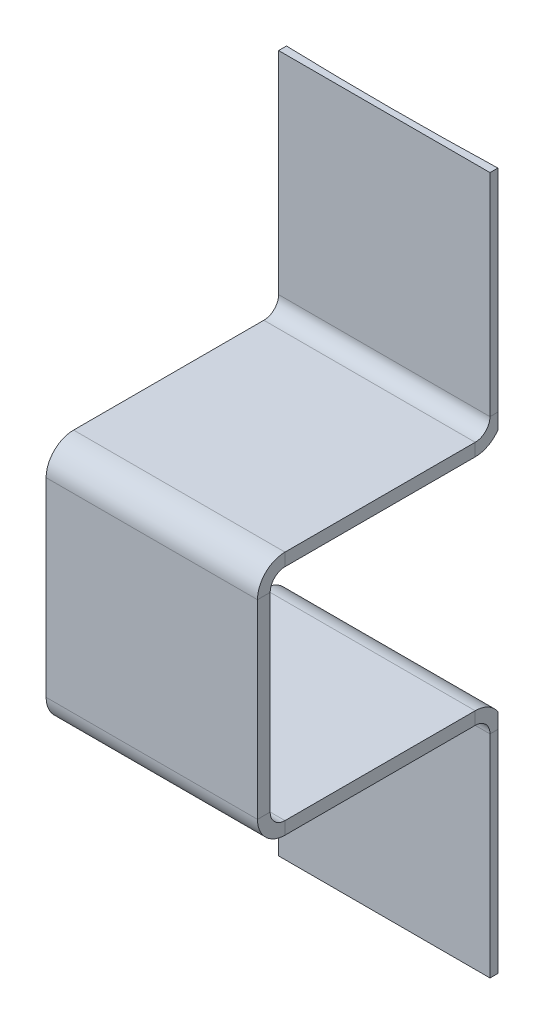
ISO-10303-21;
HEADER;
FILE_DESCRIPTION(('STEP AP214'),'2;1');
FILE_NAME('part.step','',(''),(''),'','','');
FILE_SCHEMA(('AUTOMOTIVE_DESIGN { 1 0 10303 214 1 1 1 1 }'));
ENDSEC;
DATA;
#1=APPLICATION_CONTEXT('core data for automotive mechanical design processes');
#2=APPLICATION_PROTOCOL_DEFINITION('international standard','automotive_design',2000,#1);
#3=PRODUCT_CONTEXT('',#1,'mechanical');
#4=PRODUCT('Part','Part','',(#3));
#5=PRODUCT_RELATED_PRODUCT_CATEGORY('part','',(#4));
#6=PRODUCT_DEFINITION_FORMATION('','',#4);
#7=PRODUCT_DEFINITION_CONTEXT('part definition',#1,'design');
#8=PRODUCT_DEFINITION('design','',#6,#7);
#9=PRODUCT_DEFINITION_SHAPE('','',#8);
#10=(LENGTH_UNIT() NAMED_UNIT(*) SI_UNIT(.MILLI.,.METRE.));
#11=(NAMED_UNIT(*) PLANE_ANGLE_UNIT() SI_UNIT($,.RADIAN.));
#12=(NAMED_UNIT(*) SI_UNIT($,.STERADIAN.) SOLID_ANGLE_UNIT());
#13=UNCERTAINTY_MEASURE_WITH_UNIT(LENGTH_MEASURE(1.E-05),#10,'distance_accuracy_value','');
#14=(GEOMETRIC_REPRESENTATION_CONTEXT(3) GLOBAL_UNCERTAINTY_ASSIGNED_CONTEXT((#13)) GLOBAL_UNIT_ASSIGNED_CONTEXT((#10,
#11,#12)) REPRESENTATION_CONTEXT('',''));
#15=CARTESIAN_POINT('',(0.,0.,0.));
#16=DIRECTION('',(0.,0.,1.));
#17=DIRECTION('',(1.,0.,0.));
#18=AXIS2_PLACEMENT_3D('',#15,#16,#17);
#19=CARTESIAN_POINT('',(0.,0.,0.));
#20=DIRECTION('',(0.,1.,0.));
#21=DIRECTION('',(0.,0.,-1.));
#22=AXIS2_PLACEMENT_3D('',#19,#20,#21);
#23=PLANE('',#22);
#24=CARTESIAN_POINT('',(0.,0.,-169.599));
#25=DIRECTION('',(0.,-1.,0.));
#26=DIRECTION('',(0.,0.,-1.));
#27=AXIS2_PLACEMENT_3D('',#24,#25,#26);
#28=CIRCLE('',#27,169.6);
#29=CARTESIAN_POINT('',(5.,0.,-0.0727188516187749));
#30=VERTEX_POINT('',#29);
#31=CARTESIAN_POINT('',(-5.,0.,-0.0727188516187749));
#32=VERTEX_POINT('',#31);
#33=EDGE_CURVE('E205',#30,#32,#28,.T.);
#34=ORIENTED_EDGE('',*,*,#33,.T.);
#35=DIRECTION('',(0.,0.,-1.));
#36=VECTOR('',#35,1.);
#37=CARTESIAN_POINT('',(-5.,0.,0.3));
#38=LINE('',#37,#36);
#39=CARTESIAN_POINT('',(-5.,0.,0.3));
#40=VERTEX_POINT('',#39);
#41=EDGE_CURVE('E277',#40,#32,#38,.T.);
#42=ORIENTED_EDGE('',*,*,#41,.F.);
#43=DIRECTION('',(-1.,0.,0.));
#44=VECTOR('',#43,1.);
#45=CARTESIAN_POINT('',(-5.,0.,0.3));
#46=LINE('',#45,#44);
#47=CARTESIAN_POINT('',(5.,0.,0.3));
#48=VERTEX_POINT('',#47);
#49=EDGE_CURVE('E276',#48,#40,#46,.T.);
#50=ORIENTED_EDGE('',*,*,#49,.F.);
#51=DIRECTION('',(0.,0.,1.));
#52=VECTOR('',#51,1.);
#53=CARTESIAN_POINT('',(5.,0.,0.3));
#54=LINE('',#53,#52);
#55=EDGE_CURVE('E273',#30,#48,#54,.T.);
#56=ORIENTED_EDGE('',*,*,#55,.F.);
#57=EDGE_LOOP('',(#34,#42,#50,#56));
#58=FACE_BOUND('',#57,.T.);
#59=ADVANCED_FACE('F41',(#58),#23,.T.);
#60=CARTESIAN_POINT('',(0.,-33.,0.));
#61=DIRECTION('',(0.,1.,0.));
#62=DIRECTION('',(0.,0.,-1.));
#63=AXIS2_PLACEMENT_3D('',#60,#61,#62);
#64=PLANE('',#63);
#65=DIRECTION('',(0.,0.,1.));
#66=VECTOR('',#65,1.);
#67=CARTESIAN_POINT('',(5.,-33.,0.300000000000001));
#68=LINE('',#67,#66);
#69=CARTESIAN_POINT('',(5.,-33.,-0.0727188516187749));
#70=VERTEX_POINT('',#69);
#71=CARTESIAN_POINT('',(5.,-33.,0.300000000000001));
#72=VERTEX_POINT('',#71);
#73=EDGE_CURVE('E209',#70,#72,#68,.T.);
#74=ORIENTED_EDGE('',*,*,#73,.T.);
#75=DIRECTION('',(-1.,0.,0.));
#76=VECTOR('',#75,1.);
#77=CARTESIAN_POINT('',(-5.,-33.,0.300000000000001));
#78=LINE('',#77,#76);
#79=CARTESIAN_POINT('',(-5.,-33.,0.300000000000001));
#80=VERTEX_POINT('',#79);
#81=EDGE_CURVE('E48',#72,#80,#78,.T.);
#82=ORIENTED_EDGE('',*,*,#81,.T.);
#83=DIRECTION('',(0.,0.,-1.));
#84=VECTOR('',#83,1.);
#85=CARTESIAN_POINT('',(-5.,-33.,0.300000000000001));
#86=LINE('',#85,#84);
#87=CARTESIAN_POINT('',(-5.,-33.,-0.0727188516187749));
#88=VERTEX_POINT('',#87);
#89=EDGE_CURVE('E191',#80,#88,#86,.T.);
#90=ORIENTED_EDGE('',*,*,#89,.T.);
#91=CARTESIAN_POINT('',(0.,-33.,-169.599));
#92=DIRECTION('',(0.,-1.,0.));
#93=DIRECTION('',(0.,0.,-1.));
#94=AXIS2_PLACEMENT_3D('',#91,#92,#93);
#95=CIRCLE('',#94,169.6);
#96=EDGE_CURVE('E199',#70,#88,#95,.T.);
#97=ORIENTED_EDGE('',*,*,#96,.F.);
#98=EDGE_LOOP('',(#74,#82,#90,#97));
#99=FACE_BOUND('',#98,.T.);
#100=ADVANCED_FACE('F207',(#99),#64,.F.);
#101=CARTESIAN_POINT('',(-5.,0.,0.3));
#102=DIRECTION('',(1.,0.,0.));
#103=DIRECTION('',(0.,0.,1.));
#104=AXIS2_PLACEMENT_3D('',#101,#102,#103);
#105=PLANE('',#104);
#106=DIRECTION('',(0.,0.,-1.));
#107=VECTOR('',#106,1.);
#108=CARTESIAN_POINT('',(-5.,-9.99999999999999,0.300000000000001));
#109=LINE('',#108,#107);
#110=CARTESIAN_POINT('',(-5.,-9.99999999999999,0.300000000000001));
#111=VERTEX_POINT('',#110);
#112=CARTESIAN_POINT('',(-5.,-9.99999999999999,-0.0727188516187749));
#113=VERTEX_POINT('',#112);
#114=EDGE_CURVE('E282',#111,#113,#109,.T.);
#115=ORIENTED_EDGE('',*,*,#114,.F.);
#116=DIRECTION('',(0.,-1.,0.));
#117=VECTOR('',#116,1.);
#118=CARTESIAN_POINT('',(-5.,0.,0.3));
#119=LINE('',#118,#117);
#120=EDGE_CURVE('E330',#40,#111,#119,.T.);
#121=ORIENTED_EDGE('',*,*,#120,.F.);
#122=ORIENTED_EDGE('',*,*,#41,.T.);
#123=DIRECTION('',(0.,1.,0.));
#124=VECTOR('',#123,1.);
#125=CARTESIAN_POINT('',(-5.,-33.,-0.0727188516187749));
#126=LINE('',#125,#124);
#127=EDGE_CURVE('E412',#113,#32,#126,.T.);
#128=ORIENTED_EDGE('',*,*,#127,.F.);
#129=EDGE_LOOP('',(#115,#121,#122,#128));
#130=FACE_BOUND('',#129,.T.);
#131=ADVANCED_FACE('F526',(#130),#105,.F.);
#132=CARTESIAN_POINT('',(5.,0.,0.3));
#133=DIRECTION('',(-1.,0.,0.));
#134=DIRECTION('',(0.,0.,-1.));
#135=AXIS2_PLACEMENT_3D('',#132,#133,#134);
#136=PLANE('',#135);
#137=ORIENTED_EDGE('',*,*,#55,.T.);
#138=DIRECTION('',(0.,-1.,0.));
#139=VECTOR('',#138,1.);
#140=CARTESIAN_POINT('',(5.,0.,0.3));
#141=LINE('',#140,#139);
#142=CARTESIAN_POINT('',(5.,-9.99999999999999,0.300000000000001));
#143=VERTEX_POINT('',#142);
#144=EDGE_CURVE('E281',#48,#143,#141,.T.);
#145=ORIENTED_EDGE('',*,*,#144,.T.);
#146=DIRECTION('',(0.,0.,1.));
#147=VECTOR('',#146,1.);
#148=CARTESIAN_POINT('',(5.,-9.99999999999999,0.300000000000001));
#149=LINE('',#148,#147);
#150=CARTESIAN_POINT('',(5.,-9.99999999999999,-0.0727188516187749));
#151=VERTEX_POINT('',#150);
#152=EDGE_CURVE('E278',#151,#143,#149,.T.);
#153=ORIENTED_EDGE('',*,*,#152,.F.);
#154=DIRECTION('',(0.,1.,0.));
#155=VECTOR('',#154,1.);
#156=CARTESIAN_POINT('',(5.,-33.,-0.0727188516187749));
#157=LINE('',#156,#155);
#158=EDGE_CURVE('E414',#30,#151,#157,.F.);
#159=ORIENTED_EDGE('',*,*,#158,.F.);
#160=EDGE_LOOP('',(#137,#145,#153,#159));
#161=FACE_BOUND('',#160,.T.);
#162=ADVANCED_FACE('F474',(#161),#136,.F.);
#163=CARTESIAN_POINT('',(-5.,0.,0.3));
#164=DIRECTION('',(0.,0.,-1.));
#165=DIRECTION('',(0.,-1.,0.));
#166=AXIS2_PLACEMENT_3D('',#163,#164,#165);
#167=PLANE('',#166);
#168=DIRECTION('',(-1.,0.,0.));
#169=VECTOR('',#168,1.);
#170=CARTESIAN_POINT('',(-5.,-9.99999999999999,0.300000000000001));
#171=LINE('',#170,#169);
#172=EDGE_CURVE('E285',#143,#111,#171,.T.);
#173=ORIENTED_EDGE('',*,*,#172,.F.);
#174=ORIENTED_EDGE('',*,*,#144,.F.);
#175=ORIENTED_EDGE('',*,*,#49,.T.);
#176=ORIENTED_EDGE('',*,*,#120,.T.);
#177=EDGE_LOOP('',(#173,#174,#175,#176));
#178=FACE_BOUND('',#177,.T.);
#179=ADVANCED_FACE('F539',(#178),#167,.F.);
#180=CARTESIAN_POINT('',(-5.,-9.99999999999999,0.300000000000001));
#181=DIRECTION('',(1.,0.,0.));
#182=DIRECTION('',(0.,0.,1.));
#183=AXIS2_PLACEMENT_3D('',#180,#181,#182);
#184=PLANE('',#183);
#185=CARTESIAN_POINT('',(-5.,-10.,1.));
#186=DIRECTION('',(-1.,0.,0.));
#187=DIRECTION('',(0.,0.,-1.));
#188=AXIS2_PLACEMENT_3D('',#185,#186,#187);
#189=CIRCLE('',#188,1.3);
#190=CARTESIAN_POINT('',(-5.,-10.7343529569503,-0.0727188516187749));
#191=VERTEX_POINT('',#190);
#192=CARTESIAN_POINT('',(-5.,-11.3,1.00000000000001));
#193=VERTEX_POINT('',#192);
#194=EDGE_CURVE('E224',#191,#193,#189,.T.);
#195=ORIENTED_EDGE('',*,*,#194,.T.);
#196=DIRECTION('',(0.,-1.,0.));
#197=VECTOR('',#196,1.);
#198=CARTESIAN_POINT('',(-5.,-10.7,1.00000000000001));
#199=LINE('',#198,#197);
#200=CARTESIAN_POINT('',(-5.,-10.7,1.00000000000001));
#201=VERTEX_POINT('',#200);
#202=EDGE_CURVE('E401',#201,#193,#199,.T.);
#203=ORIENTED_EDGE('',*,*,#202,.F.);
#204=CARTESIAN_POINT('',(-5.,-10.,1.));
#205=DIRECTION('',(-1.,0.,0.));
#206=DIRECTION('',(0.,0.,-1.));
#207=AXIS2_PLACEMENT_3D('',#204,#205,#206);
#208=CIRCLE('',#207,0.700000000000001);
#209=EDGE_CURVE('E333',#111,#201,#208,.T.);
#210=ORIENTED_EDGE('',*,*,#209,.F.);
#211=ORIENTED_EDGE('',*,*,#114,.T.);
#212=DIRECTION('',(0.,1.,0.));
#213=VECTOR('',#212,1.);
#214=CARTESIAN_POINT('',(-5.,-33.,-0.0727188516187749));
#215=LINE('',#214,#213);
#216=EDGE_CURVE('E416',#191,#113,#215,.T.);
#217=ORIENTED_EDGE('',*,*,#216,.F.);
#218=EDGE_LOOP('',(#195,#203,#210,#211,#217));
#219=FACE_BOUND('',#218,.T.);
#220=ADVANCED_FACE('F435',(#219),#184,.F.);
#221=CARTESIAN_POINT('',(0.,-10.,1.));
#222=DIRECTION('',(1.,0.,0.));
#223=DIRECTION('',(0.,0.,1.));
#224=AXIS2_PLACEMENT_3D('',#221,#222,#223);
#225=CYLINDRICAL_SURFACE('',#224,1.3);
#226=CARTESIAN_POINT('',(5.,-10.,1.));
#227=DIRECTION('',(-1.,0.,0.));
#228=DIRECTION('',(0.,0.,-1.));
#229=AXIS2_PLACEMENT_3D('',#226,#227,#228);
#230=CIRCLE('',#229,1.3);
#231=CARTESIAN_POINT('',(5.,-10.7343529569503,-0.0727188516187749));
#232=VERTEX_POINT('',#231);
#233=CARTESIAN_POINT('',(5.,-11.3,1.00000000000001));
#234=VERTEX_POINT('',#233);
#235=EDGE_CURVE('E223',#232,#234,#230,.T.);
#236=ORIENTED_EDGE('',*,*,#235,.T.);
#237=DIRECTION('',(1.,0.,0.));
#238=VECTOR('',#237,1.);
#239=CARTESIAN_POINT('',(-5.,-11.3,1.00000000000001));
#240=LINE('',#239,#238);
#241=EDGE_CURVE('E220',#193,#234,#240,.T.);
#242=ORIENTED_EDGE('',*,*,#241,.F.);
#243=ORIENTED_EDGE('',*,*,#194,.F.);
#244=CARTESIAN_POINT('',(5.,-10.7343529569503,-0.0727188516187749));
#245=CARTESIAN_POINT('',(4.56710657150074,-10.7529223545076,-0.0599507829004519));
#246=CARTESIAN_POINT('',(4.13403927755849,-10.7682262464902,-0.0488378920569281));
#247=CARTESIAN_POINT('',(3.48433641418812,-10.7871174579659,-0.0346573580335505));
#248=CARTESIAN_POINT('',(3.26778670418943,-10.7927365126097,-0.0303458080338849));
#249=CARTESIAN_POINT('',(2.83464152802516,-10.8027605156565,-0.0225519574346682));
#250=CARTESIAN_POINT('',(2.6180460611939,-10.807165444975,-0.0190696698702353));
#251=CARTESIAN_POINT('',(1.78491533421112,-10.8219574039432,-0.00727192238790079));
#252=CARTESIAN_POINT('',(1.16826225589085,-10.8283747085537,-0.00190258279581291));
#253=CARTESIAN_POINT('',(-0.0651044875729709,-10.8331981860363,0.00210871445944375));
#254=CARTESIAN_POINT('',(-0.681818153598923,-10.8316042164473,0.000750552490463859));
#255=CARTESIAN_POINT('',(-1.60707138051038,-10.8229836608874,-0.0063333804057084));
#256=CARTESIAN_POINT('',(-1.91566258517029,-10.8190686160109,-0.00953846242033991));
#257=CARTESIAN_POINT('',(-2.53278542991408,-10.8089910077911,-0.0176324407112478));
#258=CARTESIAN_POINT('',(-2.84131707032667,-10.8028284572274,-0.0225213274133516));
#259=CARTESIAN_POINT('',(-3.45828794792507,-10.7880189099031,-0.0339816884898349));
#260=CARTESIAN_POINT('',(-3.76672718593358,-10.7793719359627,-0.040553147409192));
#261=CARTESIAN_POINT('',(-4.38347492480908,-10.7591596553084,-0.05537637003732));
#262=CARTESIAN_POINT('',(-4.69178342303212,-10.7475942921546,-0.0636281662421999));
#263=CARTESIAN_POINT('',(-5.,-10.7343529569504,-0.0727188516187486));
#264=B_SPLINE_CURVE_WITH_KNOTS('',3,(#244,#245,#246,#247,#248,#249,#250,#251,#252,#253,#254,
#255,#256,#257,#258,#259,#260,#261,#262,#263),.UNSPECIFIED.,.F.,.F.,(4,2,2,2,2,2,2,2,2,4),(0.,
1.30040062071421,1.95039151468905,2.60039262515101,4.45041805959426,6.30047639232974,
7.22636385438622,8.15224605190095,9.07811974516451,10.0040113456367),.UNSPECIFIED.);
#265=EDGE_CURVE('E418',#232,#191,#264,.T.);
#266=ORIENTED_EDGE('',*,*,#265,.F.);
#267=EDGE_LOOP('',(#236,#242,#243,#266));
#268=FACE_BOUND('',#267,.T.);
#269=ADVANCED_FACE('F429',(#268),#225,.T.);
#270=CARTESIAN_POINT('',(5.,-9.99999999999999,0.300000000000001));
#271=DIRECTION('',(-1.,0.,0.));
#272=DIRECTION('',(0.,0.,-1.));
#273=AXIS2_PLACEMENT_3D('',#270,#271,#272);
#274=PLANE('',#273);
#275=ORIENTED_EDGE('',*,*,#152,.T.);
#276=CARTESIAN_POINT('',(5.,-10.,1.));
#277=DIRECTION('',(-1.,0.,0.));
#278=DIRECTION('',(0.,0.,-1.));
#279=AXIS2_PLACEMENT_3D('',#276,#277,#278);
#280=CIRCLE('',#279,0.700000000000001);
#281=CARTESIAN_POINT('',(5.,-10.7,1.00000000000001));
#282=VERTEX_POINT('',#281);
#283=EDGE_CURVE('E288',#143,#282,#280,.T.);
#284=ORIENTED_EDGE('',*,*,#283,.T.);
#285=DIRECTION('',(0.,1.,0.));
#286=VECTOR('',#285,1.);
#287=CARTESIAN_POINT('',(5.,-10.7,1.00000000000001));
#288=LINE('',#287,#286);
#289=EDGE_CURVE('E227',#234,#282,#288,.T.);
#290=ORIENTED_EDGE('',*,*,#289,.F.);
#291=ORIENTED_EDGE('',*,*,#235,.F.);
#292=DIRECTION('',(0.,1.,0.));
#293=VECTOR('',#292,1.);
#294=CARTESIAN_POINT('',(5.,-33.,-0.0727188516187749));
#295=LINE('',#294,#293);
#296=EDGE_CURVE('E55',#151,#232,#295,.F.);
#297=ORIENTED_EDGE('',*,*,#296,.F.);
#298=EDGE_LOOP('',(#275,#284,#290,#291,#297));
#299=FACE_BOUND('',#298,.T.);
#300=ADVANCED_FACE('F434',(#299),#274,.F.);
#301=CARTESIAN_POINT('',(0.,-10.,1.));
#302=DIRECTION('',(1.,0.,0.));
#303=DIRECTION('',(0.,0.,1.));
#304=AXIS2_PLACEMENT_3D('',#301,#302,#303);
#305=CYLINDRICAL_SURFACE('',#304,0.700000000000001);
#306=DIRECTION('',(-1.,0.,0.));
#307=VECTOR('',#306,1.);
#308=CARTESIAN_POINT('',(-5.,-10.7,1.00000000000001));
#309=LINE('',#308,#307);
#310=EDGE_CURVE('E291',#282,#201,#309,.T.);
#311=ORIENTED_EDGE('',*,*,#310,.F.);
#312=ORIENTED_EDGE('',*,*,#283,.F.);
#313=ORIENTED_EDGE('',*,*,#172,.T.);
#314=ORIENTED_EDGE('',*,*,#209,.T.);
#315=EDGE_LOOP('',(#311,#312,#313,#314));
#316=FACE_BOUND('',#315,.T.);
#317=ADVANCED_FACE('F550',(#316),#305,.F.);
#318=CARTESIAN_POINT('',(-5.,-10.7,1.00000000000001));
#319=DIRECTION('',(1.,0.,0.));
#320=DIRECTION('',(0.,0.,1.));
#321=AXIS2_PLACEMENT_3D('',#318,#319,#320);
#322=PLANE('',#321);
#323=DIRECTION('',(0.,0.,1.));
#324=VECTOR('',#323,1.);
#325=CARTESIAN_POINT('',(-5.,-11.3,1.00000000000001));
#326=LINE('',#325,#324);
#327=CARTESIAN_POINT('',(-5.,-11.3,9.99999999999999));
#328=VERTEX_POINT('',#327);
#329=EDGE_CURVE('E232',#193,#328,#326,.T.);
#330=ORIENTED_EDGE('',*,*,#329,.T.);
#331=DIRECTION('',(0.,-1.,0.));
#332=VECTOR('',#331,1.);
#333=CARTESIAN_POINT('',(-5.,-10.7,9.99999999999999));
#334=LINE('',#333,#332);
#335=CARTESIAN_POINT('',(-5.,-10.7,9.99999999999999));
#336=VERTEX_POINT('',#335);
#337=EDGE_CURVE('E394',#336,#328,#334,.T.);
#338=ORIENTED_EDGE('',*,*,#337,.F.);
#339=DIRECTION('',(0.,0.,1.));
#340=VECTOR('',#339,1.);
#341=CARTESIAN_POINT('',(-5.,-10.7,1.00000000000001));
#342=LINE('',#341,#340);
#343=EDGE_CURVE('E336',#201,#336,#342,.T.);
#344=ORIENTED_EDGE('',*,*,#343,.F.);
#345=ORIENTED_EDGE('',*,*,#202,.T.);
#346=EDGE_LOOP('',(#330,#338,#344,#345));
#347=FACE_BOUND('',#346,.T.);
#348=ADVANCED_FACE('F442',(#347),#322,.F.);
#349=CARTESIAN_POINT('',(-5.,-11.3,1.00000000000001));
#350=DIRECTION('',(0.,1.,0.));
#351=DIRECTION('',(0.,0.,-1.));
#352=AXIS2_PLACEMENT_3D('',#349,#350,#351);
#353=PLANE('',#352);
#354=DIRECTION('',(0.,0.,1.));
#355=VECTOR('',#354,1.);
#356=CARTESIAN_POINT('',(5.,-11.3,1.00000000000001));
#357=LINE('',#356,#355);
#358=CARTESIAN_POINT('',(5.,-11.3,9.99999999999999));
#359=VERTEX_POINT('',#358);
#360=EDGE_CURVE('E231',#234,#359,#357,.T.);
#361=ORIENTED_EDGE('',*,*,#360,.T.);
#362=DIRECTION('',(1.,0.,0.));
#363=VECTOR('',#362,1.);
#364=CARTESIAN_POINT('',(-5.,-11.3,9.99999999999999));
#365=LINE('',#364,#363);
#366=EDGE_CURVE('E228',#328,#359,#365,.T.);
#367=ORIENTED_EDGE('',*,*,#366,.F.);
#368=ORIENTED_EDGE('',*,*,#329,.F.);
#369=ORIENTED_EDGE('',*,*,#241,.T.);
#370=EDGE_LOOP('',(#361,#367,#368,#369));
#371=FACE_BOUND('',#370,.T.);
#372=ADVANCED_FACE('F438',(#371),#353,.F.);
#373=CARTESIAN_POINT('',(5.,-10.7,1.00000000000001));
#374=DIRECTION('',(-1.,0.,0.));
#375=DIRECTION('',(0.,0.,-1.));
#376=AXIS2_PLACEMENT_3D('',#373,#374,#375);
#377=PLANE('',#376);
#378=DIRECTION('',(0.,0.,1.));
#379=VECTOR('',#378,1.);
#380=CARTESIAN_POINT('',(5.,-10.7,1.00000000000001));
#381=LINE('',#380,#379);
#382=CARTESIAN_POINT('',(5.,-10.7,9.99999999999999));
#383=VERTEX_POINT('',#382);
#384=EDGE_CURVE('E294',#282,#383,#381,.T.);
#385=ORIENTED_EDGE('',*,*,#384,.T.);
#386=DIRECTION('',(0.,1.,0.));
#387=VECTOR('',#386,1.);
#388=CARTESIAN_POINT('',(5.,-10.7,9.99999999999999));
#389=LINE('',#388,#387);
#390=EDGE_CURVE('E235',#359,#383,#389,.T.);
#391=ORIENTED_EDGE('',*,*,#390,.F.);
#392=ORIENTED_EDGE('',*,*,#360,.F.);
#393=ORIENTED_EDGE('',*,*,#289,.T.);
#394=EDGE_LOOP('',(#385,#391,#392,#393));
#395=FACE_BOUND('',#394,.T.);
#396=ADVANCED_FACE('F441',(#395),#377,.F.);
#397=CARTESIAN_POINT('',(-5.,-10.7,1.00000000000001));
#398=DIRECTION('',(0.,-1.,0.));
#399=DIRECTION('',(0.,0.,1.));
#400=AXIS2_PLACEMENT_3D('',#397,#398,#399);
#401=PLANE('',#400);
#402=DIRECTION('',(-1.,0.,0.));
#403=VECTOR('',#402,1.);
#404=CARTESIAN_POINT('',(-5.,-10.7,9.99999999999999));
#405=LINE('',#404,#403);
#406=EDGE_CURVE('E297',#383,#336,#405,.T.);
#407=ORIENTED_EDGE('',*,*,#406,.F.);
#408=ORIENTED_EDGE('',*,*,#384,.F.);
#409=ORIENTED_EDGE('',*,*,#310,.T.);
#410=ORIENTED_EDGE('',*,*,#343,.T.);
#411=EDGE_LOOP('',(#407,#408,#409,#410));
#412=FACE_BOUND('',#411,.T.);
#413=ADVANCED_FACE('F558',(#412),#401,.F.);
#414=CARTESIAN_POINT('',(-5.,-10.7,9.99999999999999));
#415=DIRECTION('',(1.,0.,0.));
#416=DIRECTION('',(0.,0.,1.));
#417=AXIS2_PLACEMENT_3D('',#414,#415,#416);
#418=PLANE('',#417);
#419=CARTESIAN_POINT('',(-5.,-12.,10.));
#420=DIRECTION('',(1.,0.,0.));
#421=DIRECTION('',(0.,1.,0.));
#422=AXIS2_PLACEMENT_3D('',#419,#420,#421);
#423=CIRCLE('',#422,0.699999999999999);
#424=CARTESIAN_POINT('',(-5.,-12.,10.7));
#425=VERTEX_POINT('',#424);
#426=EDGE_CURVE('E240',#328,#425,#423,.T.);
#427=ORIENTED_EDGE('',*,*,#426,.T.);
#428=DIRECTION('',(0.,0.,-1.));
#429=VECTOR('',#428,1.);
#430=CARTESIAN_POINT('',(-5.,-12.,11.3));
#431=LINE('',#430,#429);
#432=CARTESIAN_POINT('',(-5.,-12.,11.3));
#433=VERTEX_POINT('',#432);
#434=EDGE_CURVE('E387',#433,#425,#431,.T.);
#435=ORIENTED_EDGE('',*,*,#434,.F.);
#436=CARTESIAN_POINT('',(-5.,-12.,10.));
#437=DIRECTION('',(1.,0.,0.));
#438=DIRECTION('',(0.,1.,0.));
#439=AXIS2_PLACEMENT_3D('',#436,#437,#438);
#440=CIRCLE('',#439,1.3);
#441=EDGE_CURVE('E339',#336,#433,#440,.T.);
#442=ORIENTED_EDGE('',*,*,#441,.F.);
#443=ORIENTED_EDGE('',*,*,#337,.T.);
#444=EDGE_LOOP('',(#427,#435,#442,#443));
#445=FACE_BOUND('',#444,.T.);
#446=ADVANCED_FACE('F448',(#445),#418,.F.);
#447=CARTESIAN_POINT('',(0.,-12.,10.));
#448=DIRECTION('',(-1.,0.,0.));
#449=DIRECTION('',(0.,0.,-1.));
#450=AXIS2_PLACEMENT_3D('',#447,#448,#449);
#451=CYLINDRICAL_SURFACE('',#450,0.699999999999999);
#452=CARTESIAN_POINT('',(5.,-12.,10.));
#453=DIRECTION('',(1.,0.,0.));
#454=DIRECTION('',(0.,1.,0.));
#455=AXIS2_PLACEMENT_3D('',#452,#453,#454);
#456=CIRCLE('',#455,0.699999999999999);
#457=CARTESIAN_POINT('',(5.,-12.,10.7));
#458=VERTEX_POINT('',#457);
#459=EDGE_CURVE('E239',#359,#458,#456,.T.);
#460=ORIENTED_EDGE('',*,*,#459,.T.);
#461=DIRECTION('',(1.,0.,0.));
#462=VECTOR('',#461,1.);
#463=CARTESIAN_POINT('',(-5.,-12.,10.7));
#464=LINE('',#463,#462);
#465=EDGE_CURVE('E236',#425,#458,#464,.T.);
#466=ORIENTED_EDGE('',*,*,#465,.F.);
#467=ORIENTED_EDGE('',*,*,#426,.F.);
#468=ORIENTED_EDGE('',*,*,#366,.T.);
#469=EDGE_LOOP('',(#460,#466,#467,#468));
#470=FACE_BOUND('',#469,.T.);
#471=ADVANCED_FACE('F444',(#470),#451,.F.);
#472=CARTESIAN_POINT('',(5.,-10.7,9.99999999999999));
#473=DIRECTION('',(-1.,0.,0.));
#474=DIRECTION('',(0.,0.,-1.));
#475=AXIS2_PLACEMENT_3D('',#472,#473,#474);
#476=PLANE('',#475);
#477=CARTESIAN_POINT('',(5.,-12.,10.));
#478=DIRECTION('',(1.,0.,0.));
#479=DIRECTION('',(0.,1.,0.));
#480=AXIS2_PLACEMENT_3D('',#477,#478,#479);
#481=CIRCLE('',#480,1.3);
#482=CARTESIAN_POINT('',(5.,-12.,11.3));
#483=VERTEX_POINT('',#482);
#484=EDGE_CURVE('E300',#383,#483,#481,.T.);
#485=ORIENTED_EDGE('',*,*,#484,.T.);
#486=DIRECTION('',(0.,0.,1.));
#487=VECTOR('',#486,1.);
#488=CARTESIAN_POINT('',(5.,-12.,11.3));
#489=LINE('',#488,#487);
#490=EDGE_CURVE('E243',#458,#483,#489,.T.);
#491=ORIENTED_EDGE('',*,*,#490,.F.);
#492=ORIENTED_EDGE('',*,*,#459,.F.);
#493=ORIENTED_EDGE('',*,*,#390,.T.);
#494=EDGE_LOOP('',(#485,#491,#492,#493));
#495=FACE_BOUND('',#494,.T.);
#496=ADVANCED_FACE('F447',(#495),#476,.F.);
#497=CARTESIAN_POINT('',(0.,-12.,10.));
#498=DIRECTION('',(-1.,0.,0.));
#499=DIRECTION('',(0.,0.,-1.));
#500=AXIS2_PLACEMENT_3D('',#497,#498,#499);
#501=CYLINDRICAL_SURFACE('',#500,1.3);
#502=DIRECTION('',(-1.,0.,0.));
#503=VECTOR('',#502,1.);
#504=CARTESIAN_POINT('',(-5.,-12.,11.3));
#505=LINE('',#504,#503);
#506=EDGE_CURVE('E303',#483,#433,#505,.T.);
#507=ORIENTED_EDGE('',*,*,#506,.F.);
#508=ORIENTED_EDGE('',*,*,#484,.F.);
#509=ORIENTED_EDGE('',*,*,#406,.T.);
#510=ORIENTED_EDGE('',*,*,#441,.T.);
#511=EDGE_LOOP('',(#507,#508,#509,#510));
#512=FACE_BOUND('',#511,.T.);
#513=ADVANCED_FACE('F565',(#512),#501,.T.);
#514=CARTESIAN_POINT('',(-5.,-12.,11.3));
#515=DIRECTION('',(1.,0.,0.));
#516=DIRECTION('',(0.,0.,1.));
#517=AXIS2_PLACEMENT_3D('',#514,#515,#516);
#518=PLANE('',#517);
#519=DIRECTION('',(0.,-1.,0.));
#520=VECTOR('',#519,1.);
#521=CARTESIAN_POINT('',(-5.,-12.,10.7));
#522=LINE('',#521,#520);
#523=CARTESIAN_POINT('',(-5.,-21.,10.7));
#524=VERTEX_POINT('',#523);
#525=EDGE_CURVE('E248',#425,#524,#522,.T.);
#526=ORIENTED_EDGE('',*,*,#525,.T.);
#527=DIRECTION('',(0.,0.,-1.));
#528=VECTOR('',#527,1.);
#529=CARTESIAN_POINT('',(-5.,-21.,11.3));
#530=LINE('',#529,#528);
#531=CARTESIAN_POINT('',(-5.,-21.,11.3));
#532=VERTEX_POINT('',#531);
#533=EDGE_CURVE('E380',#532,#524,#530,.T.);
#534=ORIENTED_EDGE('',*,*,#533,.F.);
#535=DIRECTION('',(0.,-1.,0.));
#536=VECTOR('',#535,1.);
#537=CARTESIAN_POINT('',(-5.,-12.,11.3));
#538=LINE('',#537,#536);
#539=EDGE_CURVE('E342',#433,#532,#538,.T.);
#540=ORIENTED_EDGE('',*,*,#539,.F.);
#541=ORIENTED_EDGE('',*,*,#434,.T.);
#542=EDGE_LOOP('',(#526,#534,#540,#541));
#543=FACE_BOUND('',#542,.T.);
#544=ADVANCED_FACE('F454',(#543),#518,.F.);
#545=CARTESIAN_POINT('',(-5.,-12.,10.7));
#546=DIRECTION('',(0.,0.,1.));
#547=DIRECTION('',(-1.,0.,0.));
#548=AXIS2_PLACEMENT_3D('',#545,#546,#547);
#549=PLANE('',#548);
#550=DIRECTION('',(0.,-1.,0.));
#551=VECTOR('',#550,1.);
#552=CARTESIAN_POINT('',(5.,-12.,10.7));
#553=LINE('',#552,#551);
#554=CARTESIAN_POINT('',(5.,-21.,10.7));
#555=VERTEX_POINT('',#554);
#556=EDGE_CURVE('E247',#458,#555,#553,.T.);
#557=ORIENTED_EDGE('',*,*,#556,.T.);
#558=DIRECTION('',(1.,0.,0.));
#559=VECTOR('',#558,1.);
#560=CARTESIAN_POINT('',(-5.,-21.,10.7));
#561=LINE('',#560,#559);
#562=EDGE_CURVE('E244',#524,#555,#561,.T.);
#563=ORIENTED_EDGE('',*,*,#562,.F.);
#564=ORIENTED_EDGE('',*,*,#525,.F.);
#565=ORIENTED_EDGE('',*,*,#465,.T.);
#566=EDGE_LOOP('',(#557,#563,#564,#565));
#567=FACE_BOUND('',#566,.T.);
#568=ADVANCED_FACE('F450',(#567),#549,.F.);
#569=CARTESIAN_POINT('',(5.,-12.,11.3));
#570=DIRECTION('',(-1.,0.,0.));
#571=DIRECTION('',(0.,0.,-1.));
#572=AXIS2_PLACEMENT_3D('',#569,#570,#571);
#573=PLANE('',#572);
#574=DIRECTION('',(0.,-1.,0.));
#575=VECTOR('',#574,1.);
#576=CARTESIAN_POINT('',(5.,-12.,11.3));
#577=LINE('',#576,#575);
#578=CARTESIAN_POINT('',(5.,-21.,11.3));
#579=VERTEX_POINT('',#578);
#580=EDGE_CURVE('E306',#483,#579,#577,.T.);
#581=ORIENTED_EDGE('',*,*,#580,.T.);
#582=DIRECTION('',(0.,0.,1.));
#583=VECTOR('',#582,1.);
#584=CARTESIAN_POINT('',(5.,-21.,11.3));
#585=LINE('',#584,#583);
#586=EDGE_CURVE('E251',#555,#579,#585,.T.);
#587=ORIENTED_EDGE('',*,*,#586,.F.);
#588=ORIENTED_EDGE('',*,*,#556,.F.);
#589=ORIENTED_EDGE('',*,*,#490,.T.);
#590=EDGE_LOOP('',(#581,#587,#588,#589));
#591=FACE_BOUND('',#590,.T.);
#592=ADVANCED_FACE('F453',(#591),#573,.F.);
#593=CARTESIAN_POINT('',(-5.,-12.,11.3));
#594=DIRECTION('',(0.,0.,-1.));
#595=DIRECTION('',(1.,0.,0.));
#596=AXIS2_PLACEMENT_3D('',#593,#594,#595);
#597=PLANE('',#596);
#598=DIRECTION('',(-1.,0.,0.));
#599=VECTOR('',#598,1.);
#600=CARTESIAN_POINT('',(-5.,-21.,11.3));
#601=LINE('',#600,#599);
#602=EDGE_CURVE('E309',#579,#532,#601,.T.);
#603=ORIENTED_EDGE('',*,*,#602,.F.);
#604=ORIENTED_EDGE('',*,*,#580,.F.);
#605=ORIENTED_EDGE('',*,*,#506,.T.);
#606=ORIENTED_EDGE('',*,*,#539,.T.);
#607=EDGE_LOOP('',(#603,#604,#605,#606));
#608=FACE_BOUND('',#607,.T.);
#609=ADVANCED_FACE('F499',(#608),#597,.F.);
#610=CARTESIAN_POINT('',(-5.,-21.,11.3));
#611=DIRECTION('',(1.,0.,0.));
#612=DIRECTION('',(0.,0.,1.));
#613=AXIS2_PLACEMENT_3D('',#610,#611,#612);
#614=PLANE('',#613);
#615=CARTESIAN_POINT('',(-5.,-21.,10.));
#616=DIRECTION('',(1.,0.,0.));
#617=DIRECTION('',(0.,0.,1.));
#618=AXIS2_PLACEMENT_3D('',#615,#616,#617);
#619=CIRCLE('',#618,0.699999999999999);
#620=CARTESIAN_POINT('',(-5.,-21.7,9.99999999999999));
#621=VERTEX_POINT('',#620);
#622=EDGE_CURVE('E256',#524,#621,#619,.T.);
#623=ORIENTED_EDGE('',*,*,#622,.T.);
#624=DIRECTION('',(0.,1.,0.));
#625=VECTOR('',#624,1.);
#626=CARTESIAN_POINT('',(-5.,-22.3,9.99999999999999));
#627=LINE('',#626,#625);
#628=CARTESIAN_POINT('',(-5.,-22.3,9.99999999999999));
#629=VERTEX_POINT('',#628);
#630=EDGE_CURVE('E373',#629,#621,#627,.T.);
#631=ORIENTED_EDGE('',*,*,#630,.F.);
#632=CARTESIAN_POINT('',(-5.,-21.,10.));
#633=DIRECTION('',(1.,0.,0.));
#634=DIRECTION('',(0.,0.,1.));
#635=AXIS2_PLACEMENT_3D('',#632,#633,#634);
#636=CIRCLE('',#635,1.3);
#637=EDGE_CURVE('E345',#532,#629,#636,.T.);
#638=ORIENTED_EDGE('',*,*,#637,.F.);
#639=ORIENTED_EDGE('',*,*,#533,.T.);
#640=EDGE_LOOP('',(#623,#631,#638,#639));
#641=FACE_BOUND('',#640,.T.);
#642=ADVANCED_FACE('F460',(#641),#614,.F.);
#643=CARTESIAN_POINT('',(0.,-21.,10.));
#644=DIRECTION('',(-1.,0.,0.));
#645=DIRECTION('',(0.,0.,-1.));
#646=AXIS2_PLACEMENT_3D('',#643,#644,#645);
#647=CYLINDRICAL_SURFACE('',#646,0.699999999999999);
#648=CARTESIAN_POINT('',(5.,-21.,10.));
#649=DIRECTION('',(1.,0.,0.));
#650=DIRECTION('',(0.,0.,1.));
#651=AXIS2_PLACEMENT_3D('',#648,#649,#650);
#652=CIRCLE('',#651,0.699999999999999);
#653=CARTESIAN_POINT('',(5.,-21.7,9.99999999999999));
#654=VERTEX_POINT('',#653);
#655=EDGE_CURVE('E255',#555,#654,#652,.T.);
#656=ORIENTED_EDGE('',*,*,#655,.T.);
#657=DIRECTION('',(1.,0.,0.));
#658=VECTOR('',#657,1.);
#659=CARTESIAN_POINT('',(-5.,-21.7,9.99999999999999));
#660=LINE('',#659,#658);
#661=EDGE_CURVE('E252',#621,#654,#660,.T.);
#662=ORIENTED_EDGE('',*,*,#661,.F.);
#663=ORIENTED_EDGE('',*,*,#622,.F.);
#664=ORIENTED_EDGE('',*,*,#562,.T.);
#665=EDGE_LOOP('',(#656,#662,#663,#664));
#666=FACE_BOUND('',#665,.T.);
#667=ADVANCED_FACE('F456',(#666),#647,.F.);
#668=CARTESIAN_POINT('',(5.,-21.,11.3));
#669=DIRECTION('',(-1.,0.,0.));
#670=DIRECTION('',(0.,0.,-1.));
#671=AXIS2_PLACEMENT_3D('',#668,#669,#670);
#672=PLANE('',#671);
#673=CARTESIAN_POINT('',(5.,-21.,10.));
#674=DIRECTION('',(1.,0.,0.));
#675=DIRECTION('',(0.,0.,1.));
#676=AXIS2_PLACEMENT_3D('',#673,#674,#675);
#677=CIRCLE('',#676,1.3);
#678=CARTESIAN_POINT('',(5.,-22.3,9.99999999999999));
#679=VERTEX_POINT('',#678);
#680=EDGE_CURVE('E312',#579,#679,#677,.T.);
#681=ORIENTED_EDGE('',*,*,#680,.T.);
#682=DIRECTION('',(0.,-1.,0.));
#683=VECTOR('',#682,1.);
#684=CARTESIAN_POINT('',(5.,-22.3,9.99999999999999));
#685=LINE('',#684,#683);
#686=EDGE_CURVE('E259',#654,#679,#685,.T.);
#687=ORIENTED_EDGE('',*,*,#686,.F.);
#688=ORIENTED_EDGE('',*,*,#655,.F.);
#689=ORIENTED_EDGE('',*,*,#586,.T.);
#690=EDGE_LOOP('',(#681,#687,#688,#689));
#691=FACE_BOUND('',#690,.T.);
#692=ADVANCED_FACE('F459',(#691),#672,.F.);
#693=CARTESIAN_POINT('',(0.,-21.,10.));
#694=DIRECTION('',(-1.,0.,0.));
#695=DIRECTION('',(0.,0.,-1.));
#696=AXIS2_PLACEMENT_3D('',#693,#694,#695);
#697=CYLINDRICAL_SURFACE('',#696,1.3);
#698=DIRECTION('',(-1.,0.,0.));
#699=VECTOR('',#698,1.);
#700=CARTESIAN_POINT('',(-5.,-22.3,9.99999999999999));
#701=LINE('',#700,#699);
#702=EDGE_CURVE('E315',#679,#629,#701,.T.);
#703=ORIENTED_EDGE('',*,*,#702,.F.);
#704=ORIENTED_EDGE('',*,*,#680,.F.);
#705=ORIENTED_EDGE('',*,*,#602,.T.);
#706=ORIENTED_EDGE('',*,*,#637,.T.);
#707=EDGE_LOOP('',(#703,#704,#705,#706));
#708=FACE_BOUND('',#707,.T.);
#709=ADVANCED_FACE('F497',(#708),#697,.T.);
#710=CARTESIAN_POINT('',(-5.,-22.3,9.99999999999999));
#711=DIRECTION('',(1.,0.,0.));
#712=DIRECTION('',(0.,0.,1.));
#713=AXIS2_PLACEMENT_3D('',#710,#711,#712);
#714=PLANE('',#713);
#715=DIRECTION('',(0.,0.,-1.));
#716=VECTOR('',#715,1.);
#717=CARTESIAN_POINT('',(-5.,-21.7,9.99999999999999));
#718=LINE('',#717,#716);
#719=CARTESIAN_POINT('',(-5.,-21.7,1.00000000000001));
#720=VERTEX_POINT('',#719);
#721=EDGE_CURVE('E264',#621,#720,#718,.T.);
#722=ORIENTED_EDGE('',*,*,#721,.T.);
#723=DIRECTION('',(0.,1.,0.));
#724=VECTOR('',#723,1.);
#725=CARTESIAN_POINT('',(-5.,-22.3,1.00000000000001));
#726=LINE('',#725,#724);
#727=CARTESIAN_POINT('',(-5.,-22.3,1.00000000000001));
#728=VERTEX_POINT('',#727);
#729=EDGE_CURVE('E367',#728,#720,#726,.T.);
#730=ORIENTED_EDGE('',*,*,#729,.F.);
#731=DIRECTION('',(0.,0.,-1.));
#732=VECTOR('',#731,1.);
#733=CARTESIAN_POINT('',(-5.,-22.3,9.99999999999999));
#734=LINE('',#733,#732);
#735=EDGE_CURVE('E348',#629,#728,#734,.T.);
#736=ORIENTED_EDGE('',*,*,#735,.F.);
#737=ORIENTED_EDGE('',*,*,#630,.T.);
#738=EDGE_LOOP('',(#722,#730,#736,#737));
#739=FACE_BOUND('',#738,.T.);
#740=ADVANCED_FACE('F466',(#739),#714,.F.);
#741=CARTESIAN_POINT('',(-5.,-21.7,9.99999999999999));
#742=DIRECTION('',(0.,-1.,0.));
#743=DIRECTION('',(0.,0.,1.));
#744=AXIS2_PLACEMENT_3D('',#741,#742,#743);
#745=PLANE('',#744);
#746=DIRECTION('',(0.,0.,-1.));
#747=VECTOR('',#746,1.);
#748=CARTESIAN_POINT('',(5.,-21.7,9.99999999999999));
#749=LINE('',#748,#747);
#750=CARTESIAN_POINT('',(5.,-21.7,1.00000000000001));
#751=VERTEX_POINT('',#750);
#752=EDGE_CURVE('E263',#654,#751,#749,.T.);
#753=ORIENTED_EDGE('',*,*,#752,.T.);
#754=DIRECTION('',(1.,0.,0.));
#755=VECTOR('',#754,1.);
#756=CARTESIAN_POINT('',(-5.,-21.7,1.00000000000001));
#757=LINE('',#756,#755);
#758=EDGE_CURVE('E260',#720,#751,#757,.T.);
#759=ORIENTED_EDGE('',*,*,#758,.F.);
#760=ORIENTED_EDGE('',*,*,#721,.F.);
#761=ORIENTED_EDGE('',*,*,#661,.T.);
#762=EDGE_LOOP('',(#753,#759,#760,#761));
#763=FACE_BOUND('',#762,.T.);
#764=ADVANCED_FACE('F462',(#763),#745,.F.);
#765=CARTESIAN_POINT('',(5.,-22.3,9.99999999999999));
#766=DIRECTION('',(-1.,0.,0.));
#767=DIRECTION('',(0.,0.,-1.));
#768=AXIS2_PLACEMENT_3D('',#765,#766,#767);
#769=PLANE('',#768);
#770=DIRECTION('',(0.,0.,-1.));
#771=VECTOR('',#770,1.);
#772=CARTESIAN_POINT('',(5.,-22.3,9.99999999999999));
#773=LINE('',#772,#771);
#774=CARTESIAN_POINT('',(5.,-22.3,1.00000000000001));
#775=VERTEX_POINT('',#774);
#776=EDGE_CURVE('E318',#679,#775,#773,.T.);
#777=ORIENTED_EDGE('',*,*,#776,.T.);
#778=DIRECTION('',(0.,-1.,0.));
#779=VECTOR('',#778,1.);
#780=CARTESIAN_POINT('',(5.,-22.3,1.00000000000001));
#781=LINE('',#780,#779);
#782=EDGE_CURVE('E267',#751,#775,#781,.T.);
#783=ORIENTED_EDGE('',*,*,#782,.F.);
#784=ORIENTED_EDGE('',*,*,#752,.F.);
#785=ORIENTED_EDGE('',*,*,#686,.T.);
#786=EDGE_LOOP('',(#777,#783,#784,#785));
#787=FACE_BOUND('',#786,.T.);
#788=ADVANCED_FACE('F465',(#787),#769,.F.);
#789=CARTESIAN_POINT('',(-5.,-22.3,9.99999999999999));
#790=DIRECTION('',(0.,1.,0.));
#791=DIRECTION('',(0.,0.,-1.));
#792=AXIS2_PLACEMENT_3D('',#789,#790,#791);
#793=PLANE('',#792);
#794=DIRECTION('',(-1.,0.,0.));
#795=VECTOR('',#794,1.);
#796=CARTESIAN_POINT('',(-5.,-22.3,1.00000000000001));
#797=LINE('',#796,#795);
#798=EDGE_CURVE('E321',#775,#728,#797,.T.);
#799=ORIENTED_EDGE('',*,*,#798,.F.);
#800=ORIENTED_EDGE('',*,*,#776,.F.);
#801=ORIENTED_EDGE('',*,*,#702,.T.);
#802=ORIENTED_EDGE('',*,*,#735,.T.);
#803=EDGE_LOOP('',(#799,#800,#801,#802));
#804=FACE_BOUND('',#803,.T.);
#805=ADVANCED_FACE('F507',(#804),#793,.F.);
#806=CARTESIAN_POINT('',(-5.,-22.3,1.00000000000001));
#807=DIRECTION('',(1.,0.,0.));
#808=DIRECTION('',(0.,0.,1.));
#809=AXIS2_PLACEMENT_3D('',#806,#807,#808);
#810=PLANE('',#809);
#811=DIRECTION('',(0.,0.,-1.));
#812=VECTOR('',#811,1.);
#813=CARTESIAN_POINT('',(-5.,-23.,0.3));
#814=LINE('',#813,#812);
#815=CARTESIAN_POINT('',(-5.,-23.,0.299999999999997));
#816=VERTEX_POINT('',#815);
#817=CARTESIAN_POINT('',(-5.,-23.,-0.0727188516187749));
#818=VERTEX_POINT('',#817);
#819=EDGE_CURVE('E194',#816,#818,#814,.T.);
#820=ORIENTED_EDGE('',*,*,#819,.F.);
#821=CARTESIAN_POINT('',(-5.,-23.,1.));
#822=DIRECTION('',(-1.,0.,0.));
#823=DIRECTION('',(0.,1.,0.));
#824=AXIS2_PLACEMENT_3D('',#821,#822,#823);
#825=CIRCLE('',#824,0.700000000000003);
#826=EDGE_CURVE('E217',#728,#816,#825,.T.);
#827=ORIENTED_EDGE('',*,*,#826,.F.);
#828=ORIENTED_EDGE('',*,*,#729,.T.);
#829=CARTESIAN_POINT('',(-5.,-23.,1.));
#830=DIRECTION('',(-1.,0.,0.));
#831=DIRECTION('',(0.,1.,0.));
#832=AXIS2_PLACEMENT_3D('',#829,#830,#831);
#833=CIRCLE('',#832,1.3);
#834=CARTESIAN_POINT('',(-5.,-22.2656470430497,-0.0727188516187749));
#835=VERTEX_POINT('',#834);
#836=EDGE_CURVE('E272',#720,#835,#833,.T.);
#837=ORIENTED_EDGE('',*,*,#836,.T.);
#838=DIRECTION('',(0.,1.,0.));
#839=VECTOR('',#838,1.);
#840=CARTESIAN_POINT('',(-5.,-33.,-0.0727188516187749));
#841=LINE('',#840,#839);
#842=EDGE_CURVE('E197',#818,#835,#841,.T.);
#843=ORIENTED_EDGE('',*,*,#842,.F.);
#844=EDGE_LOOP('',(#820,#827,#828,#837,#843));
#845=FACE_BOUND('',#844,.T.);
#846=ADVANCED_FACE('F362',(#845),#810,.F.);
#847=CARTESIAN_POINT('',(0.,-23.,1.));
#848=DIRECTION('',(1.,0.,0.));
#849=DIRECTION('',(0.,0.,1.));
#850=AXIS2_PLACEMENT_3D('',#847,#848,#849);
#851=CYLINDRICAL_SURFACE('',#850,1.3);
#852=ORIENTED_EDGE('',*,*,#836,.F.);
#853=ORIENTED_EDGE('',*,*,#758,.T.);
#854=CARTESIAN_POINT('',(5.,-23.,1.));
#855=DIRECTION('',(-1.,0.,0.));
#856=DIRECTION('',(0.,1.,0.));
#857=AXIS2_PLACEMENT_3D('',#854,#855,#856);
#858=CIRCLE('',#857,1.3);
#859=CARTESIAN_POINT('',(5.,-22.2656470430497,-0.0727188516187749));
#860=VERTEX_POINT('',#859);
#861=EDGE_CURVE('E268',#751,#860,#858,.T.);
#862=ORIENTED_EDGE('',*,*,#861,.T.);
#863=CARTESIAN_POINT('',(-5.,-22.2656470430497,-0.0727188516187749));
#864=CARTESIAN_POINT('',(-4.56710657150073,-22.2470776454924,-0.0599507829004518));
#865=CARTESIAN_POINT('',(-4.13403927755849,-22.2317737535098,-0.048837892056928));
#866=CARTESIAN_POINT('',(-3.48433641418812,-22.2128825420341,-0.0346573580335504));
#867=CARTESIAN_POINT('',(-3.26778670418942,-22.2072634873903,-0.0303458080338848));
#868=CARTESIAN_POINT('',(-2.83464152802516,-22.1972394843435,-0.0225519574346681));
#869=CARTESIAN_POINT('',(-2.61804606119389,-22.192834555025,-0.0190696698702351));
#870=CARTESIAN_POINT('',(-1.78491533421111,-22.1780425960568,-0.00727192238790068));
#871=CARTESIAN_POINT('',(-1.16826225589085,-22.1716252914463,-0.00190258279581282));
#872=CARTESIAN_POINT('',(0.0651044875729738,-22.1668018139637,0.00210871445944382));
#873=CARTESIAN_POINT('',(0.681818153598925,-22.1683957835527,0.000750552490463919));
#874=CARTESIAN_POINT('',(1.60707138051038,-22.1770163391126,-0.00633338040570837));
#875=CARTESIAN_POINT('',(1.91566258517029,-22.1809313839891,-0.00953846242033989));
#876=CARTESIAN_POINT('',(2.53278542991409,-22.1910089922088,-0.0176324407112478));
#877=CARTESIAN_POINT('',(2.84131707032667,-22.1971715427726,-0.0225213274133516));
#878=CARTESIAN_POINT('',(3.45828794792507,-22.2119810900969,-0.0339816884898349));
#879=CARTESIAN_POINT('',(3.76672718593358,-22.2206280640373,-0.0405531474091921));
#880=CARTESIAN_POINT('',(4.38347492480908,-22.2408403446916,-0.0553763700373201));
#881=CARTESIAN_POINT('',(4.69178342303212,-22.2524057078454,-0.0636281662422));
#882=CARTESIAN_POINT('',(5.,-22.2656470430496,-0.0727188516187487));
#883=B_SPLINE_CURVE_WITH_KNOTS('',3,(#863,#864,#865,#866,#867,#868,#869,#870,#871,#872,#873,
#874,#875,#876,#877,#878,#879,#880,#881,#882),.UNSPECIFIED.,.F.,.F.,(4,2,2,2,2,2,2,2,2,4),(0.,
1.30040062071421,1.95039151468905,2.60039262515101,4.45041805959426,6.30047639232975,
7.22636385438622,8.15224605190095,9.07811974516451,10.0040113456367),.UNSPECIFIED.);
#884=EDGE_CURVE('E477',#835,#860,#883,.T.);
#885=ORIENTED_EDGE('',*,*,#884,.F.);
#886=EDGE_LOOP('',(#852,#853,#862,#885));
#887=FACE_BOUND('',#886,.T.);
#888=ADVANCED_FACE('F468',(#887),#851,.T.);
#889=CARTESIAN_POINT('',(5.,-22.3,1.00000000000001));
#890=DIRECTION('',(-1.,0.,0.));
#891=DIRECTION('',(0.,0.,-1.));
#892=AXIS2_PLACEMENT_3D('',#889,#890,#891);
#893=PLANE('',#892);
#894=ORIENTED_EDGE('',*,*,#861,.F.);
#895=ORIENTED_EDGE('',*,*,#782,.T.);
#896=CARTESIAN_POINT('',(5.,-23.,1.));
#897=DIRECTION('',(-1.,0.,0.));
#898=DIRECTION('',(0.,1.,0.));
#899=AXIS2_PLACEMENT_3D('',#896,#897,#898);
#900=CIRCLE('',#899,0.700000000000003);
#901=CARTESIAN_POINT('',(5.,-23.,0.299999999999997));
#902=VERTEX_POINT('',#901);
#903=EDGE_CURVE('E324',#775,#902,#900,.T.);
#904=ORIENTED_EDGE('',*,*,#903,.T.);
#905=DIRECTION('',(0.,0.,1.));
#906=VECTOR('',#905,1.);
#907=CARTESIAN_POINT('',(5.,-23.,0.3));
#908=LINE('',#907,#906);
#909=CARTESIAN_POINT('',(5.,-23.,-0.0727188516187749));
#910=VERTEX_POINT('',#909);
#911=EDGE_CURVE('E271',#910,#902,#908,.T.);
#912=ORIENTED_EDGE('',*,*,#911,.F.);
#913=DIRECTION('',(0.,1.,0.));
#914=VECTOR('',#913,1.);
#915=CARTESIAN_POINT('',(5.,-33.,-0.0727188516187749));
#916=LINE('',#915,#914);
#917=EDGE_CURVE('E204',#860,#910,#916,.F.);
#918=ORIENTED_EDGE('',*,*,#917,.F.);
#919=EDGE_LOOP('',(#894,#895,#904,#912,#918));
#920=FACE_BOUND('',#919,.T.);
#921=ADVANCED_FACE('F472',(#920),#893,.F.);
#922=CARTESIAN_POINT('',(0.,-23.,1.));
#923=DIRECTION('',(1.,0.,0.));
#924=DIRECTION('',(0.,0.,1.));
#925=AXIS2_PLACEMENT_3D('',#922,#923,#924);
#926=CYLINDRICAL_SURFACE('',#925,0.700000000000003);
#927=DIRECTION('',(-1.,0.,0.));
#928=VECTOR('',#927,1.);
#929=CARTESIAN_POINT('',(-5.,-23.,0.3));
#930=LINE('',#929,#928);
#931=EDGE_CURVE('E214',#902,#816,#930,.T.);
#932=ORIENTED_EDGE('',*,*,#931,.F.);
#933=ORIENTED_EDGE('',*,*,#903,.F.);
#934=ORIENTED_EDGE('',*,*,#798,.T.);
#935=ORIENTED_EDGE('',*,*,#826,.T.);
#936=EDGE_LOOP('',(#932,#933,#934,#935));
#937=FACE_BOUND('',#936,.T.);
#938=ADVANCED_FACE('F357',(#937),#926,.F.);
#939=CARTESIAN_POINT('',(-5.,-23.,0.3));
#940=DIRECTION('',(1.,0.,0.));
#941=DIRECTION('',(0.,0.,1.));
#942=AXIS2_PLACEMENT_3D('',#939,#940,#941);
#943=PLANE('',#942);
#944=ORIENTED_EDGE('',*,*,#89,.F.);
#945=DIRECTION('',(0.,-1.,0.));
#946=VECTOR('',#945,1.);
#947=CARTESIAN_POINT('',(-5.,-23.,0.3));
#948=LINE('',#947,#946);
#949=EDGE_CURVE('E210',#816,#80,#948,.T.);
#950=ORIENTED_EDGE('',*,*,#949,.F.);
#951=ORIENTED_EDGE('',*,*,#819,.T.);
#952=DIRECTION('',(0.,1.,0.));
#953=VECTOR('',#952,1.);
#954=CARTESIAN_POINT('',(-5.,-33.,-0.0727188516187749));
#955=LINE('',#954,#953);
#956=EDGE_CURVE('E188',#88,#818,#955,.T.);
#957=ORIENTED_EDGE('',*,*,#956,.F.);
#958=EDGE_LOOP('',(#944,#950,#951,#957));
#959=FACE_BOUND('',#958,.T.);
#960=ADVANCED_FACE('F189',(#959),#943,.F.);
#961=CARTESIAN_POINT('',(5.,-23.,0.3));
#962=DIRECTION('',(-1.,0.,0.));
#963=DIRECTION('',(0.,0.,-1.));
#964=AXIS2_PLACEMENT_3D('',#961,#962,#963);
#965=PLANE('',#964);
#966=ORIENTED_EDGE('',*,*,#911,.T.);
#967=DIRECTION('',(0.,-1.,0.));
#968=VECTOR('',#967,1.);
#969=CARTESIAN_POINT('',(5.,-23.,0.3));
#970=LINE('',#969,#968);
#971=EDGE_CURVE('E212',#902,#72,#970,.T.);
#972=ORIENTED_EDGE('',*,*,#971,.T.);
#973=ORIENTED_EDGE('',*,*,#73,.F.);
#974=DIRECTION('',(0.,1.,0.));
#975=VECTOR('',#974,1.);
#976=CARTESIAN_POINT('',(5.,-33.,-0.0727188516187749));
#977=LINE('',#976,#975);
#978=EDGE_CURVE('E11',#910,#70,#977,.F.);
#979=ORIENTED_EDGE('',*,*,#978,.F.);
#980=EDGE_LOOP('',(#966,#972,#973,#979));
#981=FACE_BOUND('',#980,.T.);
#982=ADVANCED_FACE('F511',(#981),#965,.F.);
#983=CARTESIAN_POINT('',(-5.,-23.,0.3));
#984=DIRECTION('',(0.,0.,-1.));
#985=DIRECTION('',(0.,-1.,0.));
#986=AXIS2_PLACEMENT_3D('',#983,#984,#985);
#987=PLANE('',#986);
#988=ORIENTED_EDGE('',*,*,#81,.F.);
#989=ORIENTED_EDGE('',*,*,#971,.F.);
#990=ORIENTED_EDGE('',*,*,#931,.T.);
#991=ORIENTED_EDGE('',*,*,#949,.T.);
#992=EDGE_LOOP('',(#988,#989,#990,#991));
#993=FACE_BOUND('',#992,.T.);
#994=ADVANCED_FACE('F355',(#993),#987,.F.);
#995=CARTESIAN_POINT('',(0.,-33.,-169.599));
#996=DIRECTION('',(0.,1.,0.));
#997=DIRECTION('',(0.,0.,-1.));
#998=AXIS2_PLACEMENT_3D('',#995,#996,#997);
#999=CYLINDRICAL_SURFACE('',#998,169.6);
#1000=ORIENTED_EDGE('',*,*,#96,.T.);
#1001=ORIENTED_EDGE('',*,*,#956,.T.);
#1002=ORIENTED_EDGE('',*,*,#842,.T.);
#1003=ORIENTED_EDGE('',*,*,#884,.T.);
#1004=ORIENTED_EDGE('',*,*,#917,.T.);
#1005=ORIENTED_EDGE('',*,*,#978,.T.);
#1006=EDGE_LOOP('',(#1000,#1001,#1002,#1003,#1004,#1005));
#1007=FACE_BOUND('',#1006,.T.);
#1008=ADVANCED_FACE('F200',(#1007),#999,.F.);
#1009=ORIENTED_EDGE('',*,*,#216,.T.);
#1010=ORIENTED_EDGE('',*,*,#127,.T.);
#1011=ORIENTED_EDGE('',*,*,#33,.F.);
#1012=ORIENTED_EDGE('',*,*,#158,.T.);
#1013=ORIENTED_EDGE('',*,*,#296,.T.);
#1014=ORIENTED_EDGE('',*,*,#265,.T.);
#1015=EDGE_LOOP('',(#1009,#1010,#1011,#1012,#1013,#1014));
#1016=FACE_BOUND('',#1015,.T.);
#1017=ADVANCED_FACE('F426',(#1016),#999,.F.);
#1018=CLOSED_SHELL('',(#59,#100,#131,#162,#179,#220,#269,#300,#317,#348,#372,#396,#413,#446,
#471,#496,#513,#544,#568,#592,#609,#642,#667,#692,#709,#740,#764,#788,#805,#846,#888,#921,#938,
#960,#982,#994,#1008,#1017));
#1019=MANIFOLD_SOLID_BREP('B2',#1018);
#1020=ADVANCED_BREP_SHAPE_REPRESENTATION('',(#18,#1019),#14);
#1021=SHAPE_DEFINITION_REPRESENTATION(#9,#1020);
ENDSEC;
END-ISO-10303-21;
